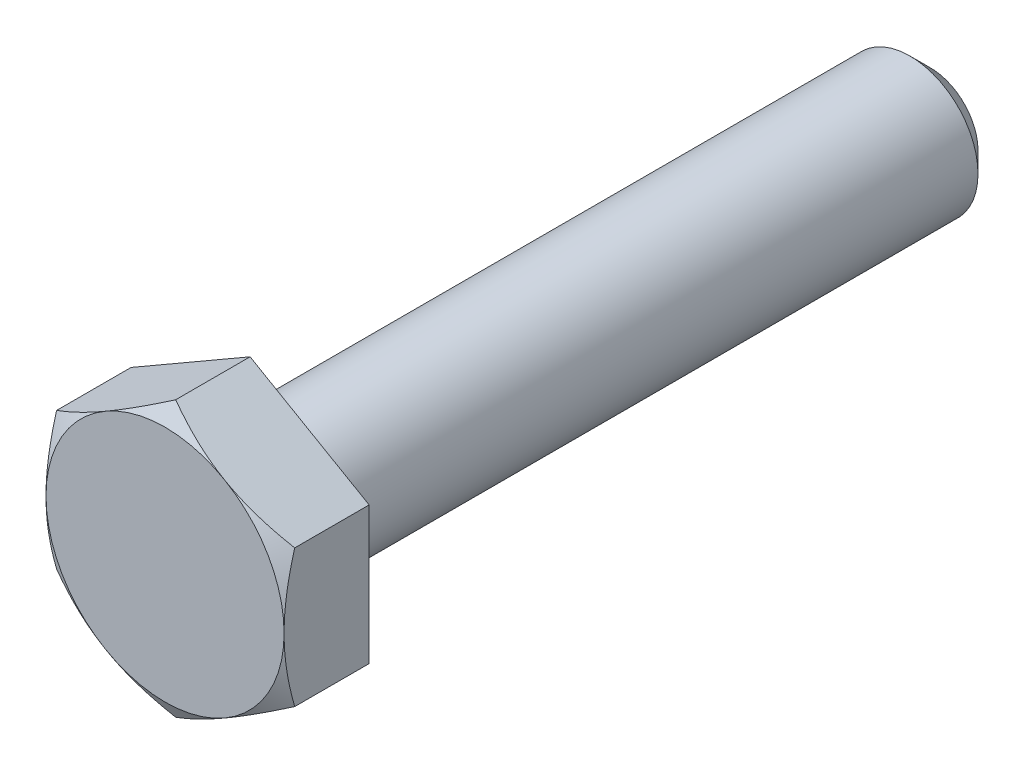
ISO-10303-21;
HEADER;
FILE_DESCRIPTION(('STEP AP214'),'2;1');
FILE_NAME('part.step','',(''),(''),'','','');
FILE_SCHEMA(('AUTOMOTIVE_DESIGN { 1 0 10303 214 1 1 1 1 }'));
ENDSEC;
DATA;
#1=APPLICATION_CONTEXT('core data for automotive mechanical design processes');
#2=APPLICATION_PROTOCOL_DEFINITION('international standard','automotive_design',2000,#1);
#3=PRODUCT_CONTEXT('',#1,'mechanical');
#4=PRODUCT('Part','Part','',(#3));
#5=PRODUCT_RELATED_PRODUCT_CATEGORY('part','',(#4));
#6=PRODUCT_DEFINITION_FORMATION('','',#4);
#7=PRODUCT_DEFINITION_CONTEXT('part definition',#1,'design');
#8=PRODUCT_DEFINITION('design','',#6,#7);
#9=PRODUCT_DEFINITION_SHAPE('','',#8);
#10=(LENGTH_UNIT() NAMED_UNIT(*) SI_UNIT(.MILLI.,.METRE.));
#11=(NAMED_UNIT(*) PLANE_ANGLE_UNIT() SI_UNIT($,.RADIAN.));
#12=(NAMED_UNIT(*) SI_UNIT($,.STERADIAN.) SOLID_ANGLE_UNIT());
#13=UNCERTAINTY_MEASURE_WITH_UNIT(LENGTH_MEASURE(1.E-05),#10,'distance_accuracy_value','');
#14=(GEOMETRIC_REPRESENTATION_CONTEXT(3) GLOBAL_UNCERTAINTY_ASSIGNED_CONTEXT((#13)) GLOBAL_UNIT_ASSIGNED_CONTEXT((#10,
#11,#12)) REPRESENTATION_CONTEXT('',''));
#15=CARTESIAN_POINT('',(0.,0.,0.));
#16=DIRECTION('',(0.,0.,1.));
#17=DIRECTION('',(1.,0.,0.));
#18=AXIS2_PLACEMENT_3D('',#15,#16,#17);
#19=CARTESIAN_POINT('',(0.,6.41580486636972,13.890625));
#20=DIRECTION('',(0.,0.,1.));
#21=DIRECTION('',(1.,0.,0.));
#22=AXIS2_PLACEMENT_3D('',#19,#20,#21);
#23=PLANE('',#22);
#24=CARTESIAN_POINT('',(0.,0.,13.890625));
#25=DIRECTION('',(0.,0.,1.));
#26=DIRECTION('',(1.,0.,0.));
#27=AXIS2_PLACEMENT_3D('',#24,#25,#26);
#28=CIRCLE('',#27,3.175);
#29=CARTESIAN_POINT('',(3.175,0.,13.890625));
#30=VERTEX_POINT('',#29);
#31=EDGE_CURVE('E251',#30,#30,#28,.T.);
#32=ORIENTED_EDGE('',*,*,#31,.T.);
#33=EDGE_LOOP('',(#32));
#34=FACE_BOUND('',#33,.T.);
#35=DIRECTION('',(0.866025403784439,0.5,0.));
#36=VECTOR('',#35,1.);
#37=CARTESIAN_POINT('',(5.55625,-3.20790243318486,13.890625));
#38=LINE('',#37,#36);
#39=CARTESIAN_POINT('',(0.,-6.41580486636972,13.890625));
#40=VERTEX_POINT('',#39);
#41=CARTESIAN_POINT('',(5.55625,-3.20790243318486,13.890625));
#42=VERTEX_POINT('',#41);
#43=EDGE_CURVE('E12',#40,#42,#38,.T.);
#44=ORIENTED_EDGE('',*,*,#43,.F.);
#45=DIRECTION('',(0.866025403784439,-0.5,0.));
#46=VECTOR('',#45,1.);
#47=CARTESIAN_POINT('',(-5.55625,-3.20790243318486,13.890625));
#48=LINE('',#47,#46);
#49=CARTESIAN_POINT('',(-5.55625,-3.20790243318486,13.890625));
#50=VERTEX_POINT('',#49);
#51=EDGE_CURVE('E49',#50,#40,#48,.T.);
#52=ORIENTED_EDGE('',*,*,#51,.F.);
#53=DIRECTION('',(0.,-1.,0.));
#54=VECTOR('',#53,1.);
#55=CARTESIAN_POINT('',(-5.55625,6.41580486636971,13.890625));
#56=LINE('',#55,#54);
#57=CARTESIAN_POINT('',(-5.55625,3.20790243318486,13.890625));
#58=VERTEX_POINT('',#57);
#59=EDGE_CURVE('E135',#58,#50,#56,.T.);
#60=ORIENTED_EDGE('',*,*,#59,.F.);
#61=DIRECTION('',(-0.866025403784439,-0.5,0.));
#62=VECTOR('',#61,1.);
#63=CARTESIAN_POINT('',(0.,6.41580486636972,13.890625));
#64=LINE('',#63,#62);
#65=CARTESIAN_POINT('',(0.,6.41580486636972,13.890625));
#66=VERTEX_POINT('',#65);
#67=EDGE_CURVE('E131',#66,#58,#64,.T.);
#68=ORIENTED_EDGE('',*,*,#67,.F.);
#69=DIRECTION('',(-0.866025403784439,0.5,0.));
#70=VECTOR('',#69,1.);
#71=CARTESIAN_POINT('',(0.,6.41580486636972,13.890625));
#72=LINE('',#71,#70);
#73=CARTESIAN_POINT('',(5.55625,3.20790243318486,13.890625));
#74=VERTEX_POINT('',#73);
#75=EDGE_CURVE('E117',#74,#66,#72,.T.);
#76=ORIENTED_EDGE('',*,*,#75,.F.);
#77=DIRECTION('',(0.,1.,0.));
#78=VECTOR('',#77,1.);
#79=CARTESIAN_POINT('',(5.55624999999999,6.41580486636972,13.890625));
#80=LINE('',#79,#78);
#81=EDGE_CURVE('E109',#42,#74,#80,.T.);
#82=ORIENTED_EDGE('',*,*,#81,.F.);
#83=EDGE_LOOP('',(#44,#52,#60,#68,#76,#82));
#84=FACE_BOUND('',#83,.T.);
#85=ADVANCED_FACE('F40',(#34,#84),#23,.F.);
#86=CARTESIAN_POINT('',(0.,0.,17.859375));
#87=DIRECTION('',(0.,0.,1.));
#88=DIRECTION('',(1.,0.,0.));
#89=AXIS2_PLACEMENT_3D('',#86,#87,#88);
#90=CYLINDRICAL_SURFACE('',#89,3.175);
#91=ORIENTED_EDGE('',*,*,#31,.F.);
#92=EDGE_LOOP('',(#91));
#93=FACE_BOUND('',#92,.T.);
#94=CARTESIAN_POINT('',(0.,0.,-16.906875));
#95=DIRECTION('',(0.,0.,1.));
#96=DIRECTION('',(1.,0.,0.));
#97=AXIS2_PLACEMENT_3D('',#94,#95,#96);
#98=CIRCLE('',#97,3.175);
#99=CARTESIAN_POINT('',(3.175,0.,-16.906875));
#100=VERTEX_POINT('',#99);
#101=EDGE_CURVE('E254',#100,#100,#98,.T.);
#102=ORIENTED_EDGE('',*,*,#101,.T.);
#103=EDGE_LOOP('',(#102));
#104=FACE_BOUND('',#103,.T.);
#105=ADVANCED_FACE('F242',(#93,#104),#90,.T.);
#106=CARTESIAN_POINT('',(0.,0.,-17.859375));
#107=DIRECTION('',(0.,0.,1.));
#108=DIRECTION('',(1.,0.,0.));
#109=AXIS2_PLACEMENT_3D('',#106,#107,#108);
#110=CONICAL_SURFACE('',#109,2.2225,0.785398163397451);
#111=ORIENTED_EDGE('',*,*,#101,.F.);
#112=EDGE_LOOP('',(#111));
#113=FACE_BOUND('',#112,.T.);
#114=CARTESIAN_POINT('',(0.,0.,-17.859375));
#115=DIRECTION('',(0.,0.,1.));
#116=DIRECTION('',(1.,0.,0.));
#117=AXIS2_PLACEMENT_3D('',#114,#115,#116);
#118=CIRCLE('',#117,2.2225);
#119=CARTESIAN_POINT('',(2.2225,0.,-17.859375));
#120=VERTEX_POINT('',#119);
#121=EDGE_CURVE('E261',#120,#120,#118,.T.);
#122=ORIENTED_EDGE('',*,*,#121,.T.);
#123=EDGE_LOOP('',(#122));
#124=FACE_BOUND('',#123,.T.);
#125=ADVANCED_FACE('F247',(#113,#124),#110,.T.);
#126=CARTESIAN_POINT('',(0.,2.2225,-17.859375));
#127=DIRECTION('',(0.,0.,1.));
#128=DIRECTION('',(1.,0.,0.));
#129=AXIS2_PLACEMENT_3D('',#126,#127,#128);
#130=PLANE('',#129);
#131=ORIENTED_EDGE('',*,*,#121,.F.);
#132=EDGE_LOOP('',(#131));
#133=FACE_BOUND('',#132,.T.);
#134=ADVANCED_FACE('F293',(#133),#130,.F.);
#135=CARTESIAN_POINT('',(0.,-6.41580486636972,-17.859375));
#136=DIRECTION('',(0.5,-0.866025403784439,0.));
#137=DIRECTION('',(0.866025403784439,0.5,0.));
#138=AXIS2_PLACEMENT_3D('',#135,#136,#137);
#139=PLANE('',#138);
#140=CARTESIAN_POINT('',(5.55645,-3.20778696313102,17.3630440980518));
#141=CARTESIAN_POINT('',(5.43431700443227,-3.27830048099899,17.4037494396287));
#142=CARTESIAN_POINT('',(5.31172863757364,-3.34907690760433,17.4426074606368));
#143=CARTESIAN_POINT('',(5.06555635055764,-3.49120454378004,17.5161200665754));
#144=CARTESIAN_POINT('',(4.94197202526351,-3.56255598725623,17.5507728381981));
#145=CARTESIAN_POINT('',(4.56924027919934,-3.7777527611819,17.6477431144389));
#146=CARTESIAN_POINT('',(4.3186215488105,-3.92244755263586,17.702898945498));
#147=CARTESIAN_POINT('',(3.94357517172046,-4.13898067940738,17.767576095153));
#148=CARTESIAN_POINT('',(3.82026814788998,-4.21017202280888,17.7860008296374));
#149=CARTESIAN_POINT('',(3.57309692257779,-4.35287639627881,17.8168966337596));
#150=CARTESIAN_POINT('',(3.44923277130254,-4.42438939736051,17.829368229438));
#151=CARTESIAN_POINT('',(3.20128932668299,-4.56753961185542,17.8480399134017));
#152=CARTESIAN_POINT('',(3.07721043832557,-4.63917659144933,17.8542471193166));
#153=CARTESIAN_POINT('',(2.82894487332451,-4.7825127822332,17.8602635825862));
#154=CARTESIAN_POINT('',(2.70475820012895,-4.85421199143242,17.8600730375727));
#155=CARTESIAN_POINT('',(2.3645224374678,-5.05064720059277,17.8507567573071));
#156=CARTESIAN_POINT('',(2.14858470770919,-5.1753189069971,17.8351153403106));
#157=CARTESIAN_POINT('',(1.71814349723526,-5.42383425573453,17.7855150950254));
#158=CARTESIAN_POINT('',(1.50364153044716,-5.54767702400135,17.7515393117333));
#159=CARTESIAN_POINT('',(1.07233397329164,-5.7966925582286,17.6666092499519));
#160=CARTESIAN_POINT('',(0.8555828090919,-5.92183390122649,17.6152951119579));
#161=CARTESIAN_POINT('',(0.425312954659249,-6.17025031750736,17.4988325447076));
#162=CARTESIAN_POINT('',(0.211788753585623,-6.29352857247572,17.4337114741206));
#163=CARTESIAN_POINT('',(-0.000199999999999207,-6.41592033642355,17.3630440980518));
#164=B_SPLINE_CURVE_WITH_KNOTS('',3,(#140,#141,#142,#143,#144,#145,#146,#147,#148,#149,#150,
#151,#152,#153,#154,#155,#156,#157,#158,#159,#160,#161,#162,#163),.UNSPECIFIED.,.F.,.F.,(4,2,2,
2,2,2,2,2,2,2,2,4),(0.,0.44031690826804,0.88082301204082,1.76366572331168,2.19427472390782,
2.62484566732155,3.05492684132791,3.48499472977669,4.23370964386674,4.98311813377592,
5.74914806559356,6.51367405016872),.UNSPECIFIED.);
#165=CARTESIAN_POINT('',(5.55625,-3.20790243318486,17.3631107665182));
#166=VERTEX_POINT('',#165);
#167=CARTESIAN_POINT('',(2.778125,-4.81185364977729,17.859375));
#168=VERTEX_POINT('',#167);
#169=EDGE_CURVE('E285',#166,#168,#164,.T.);
#170=ORIENTED_EDGE('',*,*,#169,.T.);
#171=CARTESIAN_POINT('',(0.,-6.41580486636972,17.3631107665182));
#172=VERTEX_POINT('',#171);
#173=EDGE_CURVE('E154',#168,#172,#164,.T.);
#174=ORIENTED_EDGE('',*,*,#173,.T.);
#175=DIRECTION('',(0.,0.,1.));
#176=VECTOR('',#175,1.);
#177=CARTESIAN_POINT('',(0.,-6.41580486636972,-17.859375));
#178=LINE('',#177,#176);
#179=EDGE_CURVE('E147',#40,#172,#178,.T.);
#180=ORIENTED_EDGE('',*,*,#179,.F.);
#181=ORIENTED_EDGE('',*,*,#43,.T.);
#182=DIRECTION('',(0.,0.,1.));
#183=VECTOR('',#182,1.);
#184=CARTESIAN_POINT('',(5.55625,-3.20790243318486,-17.859375));
#185=LINE('',#184,#183);
#186=EDGE_CURVE('E62',#42,#166,#185,.T.);
#187=ORIENTED_EDGE('',*,*,#186,.T.);
#188=EDGE_LOOP('',(#170,#174,#180,#181,#187));
#189=FACE_BOUND('',#188,.T.);
#190=ADVANCED_FACE('F152',(#189),#139,.T.);
#191=CARTESIAN_POINT('',(-5.55625,-3.20790243318486,-17.859375));
#192=DIRECTION('',(-0.5,-0.866025403784439,0.));
#193=DIRECTION('',(0.866025403784439,-0.5,0.));
#194=AXIS2_PLACEMENT_3D('',#191,#192,#193);
#195=PLANE('',#194);
#196=CARTESIAN_POINT('',(0.000200000000001179,-6.41592033642356,17.3630440980518));
#197=CARTESIAN_POINT('',(-0.121932995567729,-6.34540681855559,17.4037494396287));
#198=CARTESIAN_POINT('',(-0.244521362426351,-6.27463039195025,17.4426074606368));
#199=CARTESIAN_POINT('',(-0.490693649442354,-6.13250275577453,17.5161200665754));
#200=CARTESIAN_POINT('',(-0.614277974736485,-6.06115131229835,17.5507728381981));
#201=CARTESIAN_POINT('',(-0.98700972080066,-5.84595453837268,17.6477431144389));
#202=CARTESIAN_POINT('',(-1.2376284511895,-5.70125974691872,17.702898945498));
#203=CARTESIAN_POINT('',(-1.61267482827954,-5.48472662014719,17.767576095153));
#204=CARTESIAN_POINT('',(-1.73598185211002,-5.41353527674569,17.7860008296374));
#205=CARTESIAN_POINT('',(-1.98315307742221,-5.27083090327577,17.8168966337596));
#206=CARTESIAN_POINT('',(-2.10701722869746,-5.19931790219406,17.829368229438));
#207=CARTESIAN_POINT('',(-2.35496067331701,-5.05616768769916,17.8480399134017));
#208=CARTESIAN_POINT('',(-2.47903956167443,-4.98453070810525,17.8542471193166));
#209=CARTESIAN_POINT('',(-2.72730512667549,-4.84119451732138,17.8602635825862));
#210=CARTESIAN_POINT('',(-2.85149179987105,-4.76949530812216,17.8600730375727));
#211=CARTESIAN_POINT('',(-3.1917275625322,-4.5730600989618,17.8507567573071));
#212=CARTESIAN_POINT('',(-3.4076652922908,-4.44838839255747,17.8351153403106));
#213=CARTESIAN_POINT('',(-3.83810650276474,-4.19987304382004,17.7855150950254));
#214=CARTESIAN_POINT('',(-4.05260846955284,-4.07603027555323,17.7515393117333));
#215=CARTESIAN_POINT('',(-4.48391602670835,-3.82701474132597,17.6666092499519));
#216=CARTESIAN_POINT('',(-4.7006671909081,-3.70187339832809,17.6152951119579));
#217=CARTESIAN_POINT('',(-5.13093704534075,-3.45345698204721,17.4988325447076));
#218=CARTESIAN_POINT('',(-5.34446124641438,-3.33017872707885,17.4337114741206));
#219=CARTESIAN_POINT('',(-5.55645,-3.20778696313102,17.3630440980518));
#220=B_SPLINE_CURVE_WITH_KNOTS('',3,(#196,#197,#198,#199,#200,#201,#202,#203,#204,#205,#206,
#207,#208,#209,#210,#211,#212,#213,#214,#215,#216,#217,#218,#219),.UNSPECIFIED.,.F.,.F.,(4,2,2,
2,2,2,2,2,2,2,2,4),(0.,0.44031690826804,0.880823012040821,1.76366572331169,2.19427472390782,
2.62484566732156,3.05492684132791,3.48499472977669,4.23370964386674,4.98311813377593,
5.74914806559356,6.51367405016872),.UNSPECIFIED.);
#221=CARTESIAN_POINT('',(-2.778125,-4.81185364977729,17.859375));
#222=VERTEX_POINT('',#221);
#223=EDGE_CURVE('E219',#172,#222,#220,.T.);
#224=ORIENTED_EDGE('',*,*,#223,.T.);
#225=CARTESIAN_POINT('',(-5.55625,-3.20790243318486,17.3631107665182));
#226=VERTEX_POINT('',#225);
#227=EDGE_CURVE('E212',#222,#226,#220,.T.);
#228=ORIENTED_EDGE('',*,*,#227,.T.);
#229=DIRECTION('',(0.,0.,1.));
#230=VECTOR('',#229,1.);
#231=CARTESIAN_POINT('',(-5.55625,-3.20790243318486,-17.859375));
#232=LINE('',#231,#230);
#233=EDGE_CURVE('E150',#50,#226,#232,.T.);
#234=ORIENTED_EDGE('',*,*,#233,.F.);
#235=ORIENTED_EDGE('',*,*,#51,.T.);
#236=ORIENTED_EDGE('',*,*,#179,.T.);
#237=EDGE_LOOP('',(#224,#228,#234,#235,#236));
#238=FACE_BOUND('',#237,.T.);
#239=ADVANCED_FACE('F146',(#238),#195,.T.);
#240=CARTESIAN_POINT('',(-5.55625,3.20790243318486,-17.859375));
#241=DIRECTION('',(-1.,0.,0.));
#242=DIRECTION('',(0.,-1.,0.));
#243=AXIS2_PLACEMENT_3D('',#240,#241,#242);
#244=PLANE('',#243);
#245=CARTESIAN_POINT('',(-5.55625,-8.50782999855231,15.2005609936205));
#246=CARTESIAN_POINT('',(-5.55625,-8.26387920468434,15.3184514929563));
#247=CARTESIAN_POINT('',(-5.55625,-8.01935162888936,15.4351700626831));
#248=CARTESIAN_POINT('',(-5.55625,-7.52883105205287,15.6655936631179));
#249=CARTESIAN_POINT('',(-5.55625,-7.28283780620179,15.7792981720652));
#250=CARTESIAN_POINT('',(-5.55625,-6.78774519221883,16.0036229727281));
#251=CARTESIAN_POINT('',(-5.55625,-6.53863610481662,16.1142218911068));
#252=CARTESIAN_POINT('',(-5.55625,-6.03837045835484,16.3306692325657));
#253=CARTESIAN_POINT('',(-5.55625,-5.78721400682891,16.4365179032674));
#254=CARTESIAN_POINT('',(-5.55625,-5.27933633214838,16.6434582414133));
#255=CARTESIAN_POINT('',(-5.55625,-5.02258464571827,16.7444755538777));
#256=CARTESIAN_POINT('',(-5.55625,-4.50605266865306,16.9385984695724));
#257=CARTESIAN_POINT('',(-5.55625,-4.24627204471052,17.0317031925685));
#258=CARTESIAN_POINT('',(-5.55625,-3.72380338071094,17.2074994897849));
#259=CARTESIAN_POINT('',(-5.55625,-3.46112286504275,17.2902132023061));
#260=CARTESIAN_POINT('',(-5.55625,-2.93202476695536,17.4425402423092));
#261=CARTESIAN_POINT('',(-5.55625,-2.66560839507377,17.5121577125998));
#262=CARTESIAN_POINT('',(-5.55625,-2.12886945002836,17.6349161083738));
#263=CARTESIAN_POINT('',(-5.55625,-1.85854585680086,17.6880526467641));
#264=CARTESIAN_POINT('',(-5.55625,-1.31460163453648,17.7742581886233));
#265=CARTESIAN_POINT('',(-5.55625,-1.04098100258483,17.80732717435));
#266=CARTESIAN_POINT('',(-5.55625,-0.630114620405674,17.8397601022417));
#267=CARTESIAN_POINT('',(-5.55625,-0.493512012043213,17.8477109654573));
#268=CARTESIAN_POINT('',(-5.55625,-0.2200864020512,17.8578243036533));
#269=CARTESIAN_POINT('',(-5.55625,-0.0832634033068212,17.8599868538032));
#270=CARTESIAN_POINT('',(-5.55625,0.19031048853342,17.8584654746733));
#271=CARTESIAN_POINT('',(-5.55625,0.327061391088825,17.8547831861916));
#272=CARTESIAN_POINT('',(-5.55625,0.600289244692811,17.8416654510962));
#273=CARTESIAN_POINT('',(-5.55625,0.736766181719107,17.8322297171771));
#274=CARTESIAN_POINT('',(-5.55625,1.06754413918674,17.8025842538953));
#275=CARTESIAN_POINT('',(-5.55625,1.2615909674425,17.7794916153179));
#276=CARTESIAN_POINT('',(-5.55625,1.64819771360456,17.7229563361188));
#277=CARTESIAN_POINT('',(-5.55625,1.84075721093899,17.6895108704783));
#278=CARTESIAN_POINT('',(-5.55625,2.22423036877677,17.6134560841777));
#279=CARTESIAN_POINT('',(-5.55625,2.41514229438046,17.5708380990349));
#280=CARTESIAN_POINT('',(-5.55625,2.79500193689531,17.4777386141379));
#281=CARTESIAN_POINT('',(-5.55625,2.98394983705747,17.4272578551645));
#282=CARTESIAN_POINT('',(-5.55625,3.3645351688844,17.3183209523439));
#283=CARTESIAN_POINT('',(-5.55625,3.55612499818015,17.2596996457415));
#284=CARTESIAN_POINT('',(-5.55625,3.93727954771267,17.1366649088192));
#285=CARTESIAN_POINT('',(-5.55625,4.12684556523497,17.0722554735591));
#286=CARTESIAN_POINT('',(-5.55625,4.50319183158671,16.938974919127));
#287=CARTESIAN_POINT('',(-5.55625,4.68998175477346,16.8701309539257));
#288=CARTESIAN_POINT('',(-5.55625,5.06211237038498,16.7284022748082));
#289=CARTESIAN_POINT('',(-5.55625,5.24745244205056,16.6555159277593));
#290=CARTESIAN_POINT('',(-5.55625,5.43211919373702,16.5810082706005));
#291=B_SPLINE_CURVE_WITH_KNOTS('',3,(#245,#246,#247,#248,#249,#250,#251,#252,#253,#254,#255,
#256,#257,#258,#259,#260,#261,#262,#263,#264,#265,#266,#267,#268,#269,#270,#271,#272,#273,#274,
#275,#276,#277,#278,#279,#280,#281,#282,#283,#284,#285,#286,#287,#288,#289,#290),.UNSPECIFIED.,
.F.,.F.,(4,2,2,2,2,2,2,2,2,2,2,2,2,2,2,2,2,2,2,2,2,2,4),(0.,0.812840193064368,1.62582018906679,
2.44345254125443,3.26104222217516,4.08866936698069,4.91638846078596,5.74231304243997,
6.56797591370338,7.39385838161426,8.21974157970798,8.63013879180273,9.04053067427818,
9.4508073694617,9.86110455399075,10.4470263773935,11.0331082248588,11.6197461419715,
12.2063288231597,12.8072899135788,13.4078393509161,14.0050084925615,14.6024206748504),.UNSPECIFIED.);
#292=CARTESIAN_POINT('',(-5.55625,0.,17.859375));
#293=VERTEX_POINT('',#292);
#294=EDGE_CURVE('E220',#226,#293,#291,.T.);
#295=ORIENTED_EDGE('',*,*,#294,.T.);
#296=CARTESIAN_POINT('',(-5.55625,3.20790243318486,17.3631107665182));
#297=VERTEX_POINT('',#296);
#298=EDGE_CURVE('E205',#293,#297,#291,.T.);
#299=ORIENTED_EDGE('',*,*,#298,.T.);
#300=DIRECTION('',(0.,0.,1.));
#301=VECTOR('',#300,1.);
#302=CARTESIAN_POINT('',(-5.55625,3.20790243318486,-17.859375));
#303=LINE('',#302,#301);
#304=EDGE_CURVE('E161',#58,#297,#303,.T.);
#305=ORIENTED_EDGE('',*,*,#304,.F.);
#306=ORIENTED_EDGE('',*,*,#59,.T.);
#307=ORIENTED_EDGE('',*,*,#233,.T.);
#308=EDGE_LOOP('',(#295,#299,#305,#306,#307));
#309=FACE_BOUND('',#308,.T.);
#310=ADVANCED_FACE('F228',(#309),#244,.T.);
#311=CARTESIAN_POINT('',(0.,6.41580486636972,-17.859375));
#312=DIRECTION('',(-0.5,0.866025403784439,0.));
#313=DIRECTION('',(-0.866025403784439,-0.5,0.));
#314=AXIS2_PLACEMENT_3D('',#311,#312,#313);
#315=PLANE('',#314);
#316=CARTESIAN_POINT('',(-5.55645,3.20778696313102,17.3630440980518));
#317=CARTESIAN_POINT('',(-5.43431700443227,3.27830048099899,17.4037494396287));
#318=CARTESIAN_POINT('',(-5.31172863757365,3.34907690760433,17.4426074606368));
#319=CARTESIAN_POINT('',(-5.06555635055764,3.49120454378004,17.5161200665754));
#320=CARTESIAN_POINT('',(-4.94197202526351,3.56255598725623,17.5507728381981));
#321=CARTESIAN_POINT('',(-4.56924027919934,3.7777527611819,17.6477431144389));
#322=CARTESIAN_POINT('',(-4.3186215488105,3.92244755263586,17.702898945498));
#323=CARTESIAN_POINT('',(-3.94357517172046,4.13898067940738,17.767576095153));
#324=CARTESIAN_POINT('',(-3.82026814788998,4.21017202280888,17.7860008296374));
#325=CARTESIAN_POINT('',(-3.57309692257779,4.35287639627881,17.8168966337596));
#326=CARTESIAN_POINT('',(-3.44923277130254,4.42438939736052,17.829368229438));
#327=CARTESIAN_POINT('',(-3.20128932668299,4.56753961185542,17.8480399134017));
#328=CARTESIAN_POINT('',(-3.07721043832557,4.63917659144933,17.8542471193166));
#329=CARTESIAN_POINT('',(-2.82894487332451,4.7825127822332,17.8602635825862));
#330=CARTESIAN_POINT('',(-2.70475820012895,4.85421199143242,17.8600730375727));
#331=CARTESIAN_POINT('',(-2.3645224374678,5.05064720059277,17.8507567573071));
#332=CARTESIAN_POINT('',(-2.14858470770919,5.1753189069971,17.8351153403106));
#333=CARTESIAN_POINT('',(-1.71814349723526,5.42383425573453,17.7855150950254));
#334=CARTESIAN_POINT('',(-1.50364153044716,5.54767702400135,17.7515393117333));
#335=CARTESIAN_POINT('',(-1.07233397329164,5.79669255822861,17.6666092499519));
#336=CARTESIAN_POINT('',(-0.8555828090919,5.92183390122649,17.6152951119579));
#337=CARTESIAN_POINT('',(-0.42531295465925,6.17025031750736,17.4988325447076));
#338=CARTESIAN_POINT('',(-0.211788753585623,6.29352857247572,17.4337114741206));
#339=CARTESIAN_POINT('',(0.000199999999998085,6.41592033642355,17.3630440980518));
#340=B_SPLINE_CURVE_WITH_KNOTS('',3,(#316,#317,#318,#319,#320,#321,#322,#323,#324,#325,#326,
#327,#328,#329,#330,#331,#332,#333,#334,#335,#336,#337,#338,#339),.UNSPECIFIED.,.F.,.F.,(4,2,2,
2,2,2,2,2,2,2,2,4),(0.,0.440316908268041,0.880823012040821,1.76366572331169,2.19427472390782,
2.62484566732156,3.05492684132791,3.48499472977669,4.23370964386674,4.98311813377593,
5.74914806559356,6.51367405016872),.UNSPECIFIED.);
#341=CARTESIAN_POINT('',(-2.778125,4.81185364977729,17.859375));
#342=VERTEX_POINT('',#341);
#343=EDGE_CURVE('E419',#297,#342,#340,.T.);
#344=ORIENTED_EDGE('',*,*,#343,.T.);
#345=CARTESIAN_POINT('',(0.,6.41580486636972,17.3631107665182));
#346=VERTEX_POINT('',#345);
#347=EDGE_CURVE('E198',#342,#346,#340,.T.);
#348=ORIENTED_EDGE('',*,*,#347,.T.);
#349=DIRECTION('',(0.,0.,1.));
#350=VECTOR('',#349,1.);
#351=CARTESIAN_POINT('',(0.,6.41580486636972,-17.859375));
#352=LINE('',#351,#350);
#353=EDGE_CURVE('E127',#66,#346,#352,.T.);
#354=ORIENTED_EDGE('',*,*,#353,.F.);
#355=ORIENTED_EDGE('',*,*,#67,.T.);
#356=ORIENTED_EDGE('',*,*,#304,.T.);
#357=EDGE_LOOP('',(#344,#348,#354,#355,#356));
#358=FACE_BOUND('',#357,.T.);
#359=ADVANCED_FACE('F231',(#358),#315,.T.);
#360=CARTESIAN_POINT('',(5.55625,3.20790243318486,-17.859375));
#361=DIRECTION('',(0.5,0.866025403784439,0.));
#362=DIRECTION('',(-0.866025403784439,0.5,0.));
#363=AXIS2_PLACEMENT_3D('',#360,#361,#362);
#364=PLANE('',#363);
#365=CARTESIAN_POINT('',(-0.000200000000000881,6.41592033642355,17.3630440980518));
#366=CARTESIAN_POINT('',(0.121932995567729,6.34540681855559,17.4037494396287));
#367=CARTESIAN_POINT('',(0.244521362426351,6.27463039195025,17.4426074606368));
#368=CARTESIAN_POINT('',(0.490693649442354,6.13250275577453,17.5161200665754));
#369=CARTESIAN_POINT('',(0.614277974736485,6.06115131229835,17.5507728381981));
#370=CARTESIAN_POINT('',(0.98700972080066,5.84595453837268,17.6477431144389));
#371=CARTESIAN_POINT('',(1.2376284511895,5.70125974691872,17.702898945498));
#372=CARTESIAN_POINT('',(1.61267482827954,5.48472662014719,17.767576095153));
#373=CARTESIAN_POINT('',(1.73598185211002,5.41353527674569,17.7860008296374));
#374=CARTESIAN_POINT('',(1.98315307742221,5.27083090327577,17.8168966337596));
#375=CARTESIAN_POINT('',(2.10701722869746,5.19931790219406,17.829368229438));
#376=CARTESIAN_POINT('',(2.35496067331701,5.05616768769916,17.8480399134017));
#377=CARTESIAN_POINT('',(2.47903956167443,4.98453070810525,17.8542471193166));
#378=CARTESIAN_POINT('',(2.72730512667549,4.84119451732138,17.8602635825862));
#379=CARTESIAN_POINT('',(2.85149179987105,4.76949530812216,17.8600730375727));
#380=CARTESIAN_POINT('',(3.1917275625322,4.5730600989618,17.8507567573071));
#381=CARTESIAN_POINT('',(3.40766529229081,4.44838839255747,17.8351153403106));
#382=CARTESIAN_POINT('',(3.83810650276474,4.19987304382004,17.7855150950254));
#383=CARTESIAN_POINT('',(4.05260846955284,4.07603027555323,17.7515393117333));
#384=CARTESIAN_POINT('',(4.48391602670835,3.82701474132597,17.6666092499519));
#385=CARTESIAN_POINT('',(4.7006671909081,3.70187339832809,17.6152951119579));
#386=CARTESIAN_POINT('',(5.13093704534075,3.45345698204721,17.4988325447076));
#387=CARTESIAN_POINT('',(5.34446124641437,3.33017872707885,17.4337114741206));
#388=CARTESIAN_POINT('',(5.55644999999999,3.20778696313102,17.3630440980518));
#389=B_SPLINE_CURVE_WITH_KNOTS('',3,(#365,#366,#367,#368,#369,#370,#371,#372,#373,#374,#375,
#376,#377,#378,#379,#380,#381,#382,#383,#384,#385,#386,#387,#388),.UNSPECIFIED.,.F.,.F.,(4,2,2,
2,2,2,2,2,2,2,2,4),(0.,0.440316908268039,0.880823012040821,1.76366572331169,2.19427472390782,
2.62484566732156,3.05492684132791,3.48499472977669,4.23370964386674,4.98311813377592,
5.74914806559356,6.51367405016872),.UNSPECIFIED.);
#390=CARTESIAN_POINT('',(2.778125,4.81185364977729,17.859375));
#391=VERTEX_POINT('',#390);
#392=EDGE_CURVE('E424',#346,#391,#389,.T.);
#393=ORIENTED_EDGE('',*,*,#392,.T.);
#394=CARTESIAN_POINT('',(5.55625,3.20790243318486,17.3631107665182));
#395=VERTEX_POINT('',#394);
#396=EDGE_CURVE('E125',#391,#395,#389,.T.);
#397=ORIENTED_EDGE('',*,*,#396,.T.);
#398=DIRECTION('',(0.,0.,1.));
#399=VECTOR('',#398,1.);
#400=CARTESIAN_POINT('',(5.55625,3.20790243318486,-17.859375));
#401=LINE('',#400,#399);
#402=EDGE_CURVE('E112',#74,#395,#401,.T.);
#403=ORIENTED_EDGE('',*,*,#402,.F.);
#404=ORIENTED_EDGE('',*,*,#75,.T.);
#405=ORIENTED_EDGE('',*,*,#353,.T.);
#406=EDGE_LOOP('',(#393,#397,#403,#404,#405));
#407=FACE_BOUND('',#406,.T.);
#408=ADVANCED_FACE('F121',(#407),#364,.T.);
#409=CARTESIAN_POINT('',(5.55625,-3.20790243318486,-17.859375));
#410=DIRECTION('',(1.,0.,0.));
#411=DIRECTION('',(0.,1.,0.));
#412=AXIS2_PLACEMENT_3D('',#409,#410,#411);
#413=PLANE('',#412);
#414=CARTESIAN_POINT('',(5.55625,-8.50782999855231,15.2005609936205));
#415=CARTESIAN_POINT('',(5.55625,-8.26387920468434,15.3184514929563));
#416=CARTESIAN_POINT('',(5.55625,-8.01935162888936,15.4351700626831));
#417=CARTESIAN_POINT('',(5.55625,-7.52883105205287,15.6655936631179));
#418=CARTESIAN_POINT('',(5.55625,-7.28283780620179,15.7792981720651));
#419=CARTESIAN_POINT('',(5.55625,-6.78774519221884,16.0036229727281));
#420=CARTESIAN_POINT('',(5.55625,-6.53863610481662,16.1142218911068));
#421=CARTESIAN_POINT('',(5.55625,-6.03837045835485,16.3306692325657));
#422=CARTESIAN_POINT('',(5.55625,-5.78721400682891,16.4365179032674));
#423=CARTESIAN_POINT('',(5.55625,-5.27933633214838,16.6434582414133));
#424=CARTESIAN_POINT('',(5.55625,-5.02258464571827,16.7444755538777));
#425=CARTESIAN_POINT('',(5.55625,-4.50605266865306,16.9385984695724));
#426=CARTESIAN_POINT('',(5.55625,-4.24627204471052,17.0317031925685));
#427=CARTESIAN_POINT('',(5.55625,-3.72380338071094,17.2074994897849));
#428=CARTESIAN_POINT('',(5.55625,-3.46112286504276,17.2902132023061));
#429=CARTESIAN_POINT('',(5.55625,-2.93202476695536,17.4425402423092));
#430=CARTESIAN_POINT('',(5.55625,-2.66560839507377,17.5121577125998));
#431=CARTESIAN_POINT('',(5.55625,-2.12886945002836,17.6349161083738));
#432=CARTESIAN_POINT('',(5.55625,-1.85854585680086,17.6880526467641));
#433=CARTESIAN_POINT('',(5.55625,-1.31460163453648,17.7742581886233));
#434=CARTESIAN_POINT('',(5.55625,-1.04098100258483,17.80732717435));
#435=CARTESIAN_POINT('',(5.55625,-0.630114620405673,17.8397601022417));
#436=CARTESIAN_POINT('',(5.55625,-0.493512012043212,17.8477109654573));
#437=CARTESIAN_POINT('',(5.55625,-0.220086402051199,17.8578243036533));
#438=CARTESIAN_POINT('',(5.55625,-0.0832634033068205,17.8599868538032));
#439=CARTESIAN_POINT('',(5.55625,0.190310488533421,17.8584654746733));
#440=CARTESIAN_POINT('',(5.55625,0.327061391088826,17.8547831861916));
#441=CARTESIAN_POINT('',(5.55625,0.600289244692812,17.8416654510962));
#442=CARTESIAN_POINT('',(5.55625,0.736766181719108,17.8322297171771));
#443=CARTESIAN_POINT('',(5.55625,1.06754413918674,17.8025842538953));
#444=CARTESIAN_POINT('',(5.55625,1.2615909674425,17.7794916153179));
#445=CARTESIAN_POINT('',(5.55625,1.64819771360456,17.7229563361188));
#446=CARTESIAN_POINT('',(5.55625,1.84075721093899,17.6895108704783));
#447=CARTESIAN_POINT('',(5.55625,2.22423036877677,17.6134560841777));
#448=CARTESIAN_POINT('',(5.55625,2.41514229438046,17.5708380990349));
#449=CARTESIAN_POINT('',(5.55625,2.79500193689531,17.4777386141379));
#450=CARTESIAN_POINT('',(5.55625,2.98394983705747,17.4272578551645));
#451=CARTESIAN_POINT('',(5.55625,3.3645351688844,17.3183209523439));
#452=CARTESIAN_POINT('',(5.55625,3.55612499818015,17.2596996457415));
#453=CARTESIAN_POINT('',(5.55625,3.93727954771267,17.1366649088192));
#454=CARTESIAN_POINT('',(5.55625,4.12684556523497,17.0722554735591));
#455=CARTESIAN_POINT('',(5.55625,4.50319183158671,16.938974919127));
#456=CARTESIAN_POINT('',(5.55624999999999,4.68998175477346,16.8701309539257));
#457=CARTESIAN_POINT('',(5.55624999999999,5.06211237038498,16.7284022748082));
#458=CARTESIAN_POINT('',(5.55624999999999,5.24745244205056,16.6555159277593));
#459=CARTESIAN_POINT('',(5.55624999999999,5.43211919373701,16.5810082706005));
#460=B_SPLINE_CURVE_WITH_KNOTS('',3,(#414,#415,#416,#417,#418,#419,#420,#421,#422,#423,#424,
#425,#426,#427,#428,#429,#430,#431,#432,#433,#434,#435,#436,#437,#438,#439,#440,#441,#442,#443,
#444,#445,#446,#447,#448,#449,#450,#451,#452,#453,#454,#455,#456,#457,#458,#459),.UNSPECIFIED.,
.F.,.F.,(4,2,2,2,2,2,2,2,2,2,2,2,2,2,2,2,2,2,2,2,2,2,4),(0.,0.812840193064369,1.62582018906679,
2.44345254125443,3.26104222217516,4.08866936698069,4.91638846078596,5.74231304243996,
6.56797591370338,7.39385838161426,8.21974157970798,8.63013879180274,9.04053067427819,
9.4508073694617,9.86110455399075,10.4470263773935,11.0331082248588,11.6197461419715,
12.2063288231597,12.8072899135788,13.4078393509161,14.0050084925615,14.6024206748504),.UNSPECIFIED.);
#461=CARTESIAN_POINT('',(5.55625,0.,17.859375));
#462=VERTEX_POINT('',#461);
#463=EDGE_CURVE('E56',#395,#462,#460,.F.);
#464=ORIENTED_EDGE('',*,*,#463,.T.);
#465=EDGE_CURVE('E156',#462,#166,#460,.F.);
#466=ORIENTED_EDGE('',*,*,#465,.T.);
#467=ORIENTED_EDGE('',*,*,#186,.F.);
#468=ORIENTED_EDGE('',*,*,#81,.T.);
#469=ORIENTED_EDGE('',*,*,#402,.T.);
#470=EDGE_LOOP('',(#464,#466,#467,#468,#469));
#471=FACE_BOUND('',#470,.T.);
#472=ADVANCED_FACE('F111',(#471),#413,.T.);
#473=CARTESIAN_POINT('',(0.,0.,17.3631107665182));
#474=DIRECTION('',(0.,0.,-1.));
#475=DIRECTION('',(-1.,0.,0.));
#476=AXIS2_PLACEMENT_3D('',#473,#474,#475);
#477=CONICAL_SURFACE('',#476,6.41580486636972,1.04719755119661);
#478=ORIENTED_EDGE('',*,*,#173,.F.);
#479=CARTESIAN_POINT('',(0.,0.,17.859375));
#480=DIRECTION('',(0.,0.,1.));
#481=DIRECTION('',(1.,0.,0.));
#482=AXIS2_PLACEMENT_3D('',#479,#480,#481);
#483=CIRCLE('',#482,5.55625);
#484=EDGE_CURVE('E259',#222,#168,#483,.T.);
#485=ORIENTED_EDGE('',*,*,#484,.F.);
#486=ORIENTED_EDGE('',*,*,#223,.F.);
#487=EDGE_LOOP('',(#478,#485,#486));
#488=FACE_BOUND('',#487,.T.);
#489=ADVANCED_FACE('F189',(#488),#477,.T.);
#490=ORIENTED_EDGE('',*,*,#227,.F.);
#491=EDGE_CURVE('E274',#293,#222,#483,.T.);
#492=ORIENTED_EDGE('',*,*,#491,.F.);
#493=ORIENTED_EDGE('',*,*,#294,.F.);
#494=EDGE_LOOP('',(#490,#492,#493));
#495=FACE_BOUND('',#494,.T.);
#496=ADVANCED_FACE('F352',(#495),#477,.T.);
#497=ORIENTED_EDGE('',*,*,#298,.F.);
#498=EDGE_CURVE('E270',#342,#293,#483,.T.);
#499=ORIENTED_EDGE('',*,*,#498,.F.);
#500=ORIENTED_EDGE('',*,*,#343,.F.);
#501=EDGE_LOOP('',(#497,#499,#500));
#502=FACE_BOUND('',#501,.T.);
#503=ADVANCED_FACE('F344',(#502),#477,.T.);
#504=ORIENTED_EDGE('',*,*,#347,.F.);
#505=EDGE_CURVE('E265',#391,#342,#483,.T.);
#506=ORIENTED_EDGE('',*,*,#505,.F.);
#507=ORIENTED_EDGE('',*,*,#392,.F.);
#508=EDGE_LOOP('',(#504,#506,#507));
#509=FACE_BOUND('',#508,.T.);
#510=ADVANCED_FACE('F336',(#509),#477,.T.);
#511=ORIENTED_EDGE('',*,*,#396,.F.);
#512=EDGE_CURVE('E118',#462,#391,#483,.T.);
#513=ORIENTED_EDGE('',*,*,#512,.F.);
#514=ORIENTED_EDGE('',*,*,#463,.F.);
#515=EDGE_LOOP('',(#511,#513,#514));
#516=FACE_BOUND('',#515,.T.);
#517=ADVANCED_FACE('F190',(#516),#477,.T.);
#518=CARTESIAN_POINT('',(0.,0.,17.859375));
#519=DIRECTION('',(0.,0.,-1.));
#520=DIRECTION('',(-1.,0.,0.));
#521=AXIS2_PLACEMENT_3D('',#518,#519,#520);
#522=PLANE('',#521);
#523=ORIENTED_EDGE('',*,*,#512,.T.);
#524=ORIENTED_EDGE('',*,*,#505,.T.);
#525=ORIENTED_EDGE('',*,*,#498,.T.);
#526=ORIENTED_EDGE('',*,*,#491,.T.);
#527=ORIENTED_EDGE('',*,*,#484,.T.);
#528=EDGE_CURVE('E253',#168,#462,#483,.T.);
#529=ORIENTED_EDGE('',*,*,#528,.T.);
#530=EDGE_LOOP('',(#523,#524,#525,#526,#527,#529));
#531=FACE_BOUND('',#530,.T.);
#532=ADVANCED_FACE('F42',(#531),#522,.F.);
#533=ORIENTED_EDGE('',*,*,#169,.F.);
#534=ORIENTED_EDGE('',*,*,#465,.F.);
#535=ORIENTED_EDGE('',*,*,#528,.F.);
#536=EDGE_LOOP('',(#533,#534,#535));
#537=FACE_BOUND('',#536,.T.);
#538=ADVANCED_FACE('F184',(#537),#477,.T.);
#539=CLOSED_SHELL('',(#85,#105,#125,#134,#190,#239,#310,#359,#408,#472,#489,#496,#503,#510,#517,
#532,#538));
#540=MANIFOLD_SOLID_BREP('B2',#539);
#541=ADVANCED_BREP_SHAPE_REPRESENTATION('',(#18,#540),#14);
#542=SHAPE_DEFINITION_REPRESENTATION(#9,#541);
ENDSEC;
END-ISO-10303-21;
